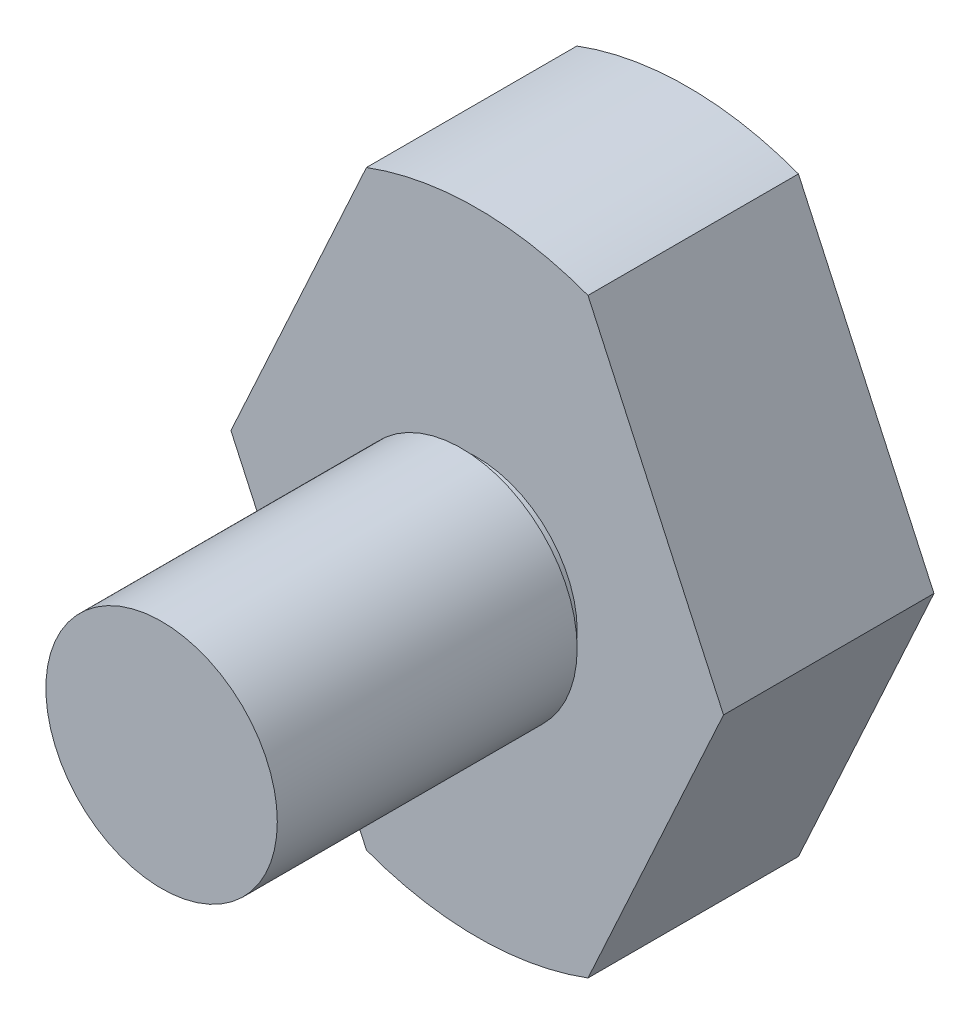
ISO-10303-21;
HEADER;
FILE_DESCRIPTION(('STEP AP214'),'2;1');
FILE_NAME('part.step','',(''),(''),'','','');
FILE_SCHEMA(('AUTOMOTIVE_DESIGN { 1 0 10303 214 1 1 1 1 }'));
ENDSEC;
DATA;
#1=APPLICATION_CONTEXT('core data for automotive mechanical design processes');
#2=APPLICATION_PROTOCOL_DEFINITION('international standard','automotive_design',2000,#1);
#3=PRODUCT_CONTEXT('',#1,'mechanical');
#4=PRODUCT('Part','Part','',(#3));
#5=PRODUCT_RELATED_PRODUCT_CATEGORY('part','',(#4));
#6=PRODUCT_DEFINITION_FORMATION('','',#4);
#7=PRODUCT_DEFINITION_CONTEXT('part definition',#1,'design');
#8=PRODUCT_DEFINITION('design','',#6,#7);
#9=PRODUCT_DEFINITION_SHAPE('','',#8);
#10=(LENGTH_UNIT() NAMED_UNIT(*) SI_UNIT(.MILLI.,.METRE.));
#11=(NAMED_UNIT(*) PLANE_ANGLE_UNIT() SI_UNIT($,.RADIAN.));
#12=(NAMED_UNIT(*) SI_UNIT($,.STERADIAN.) SOLID_ANGLE_UNIT());
#13=UNCERTAINTY_MEASURE_WITH_UNIT(LENGTH_MEASURE(1.E-05),#10,'distance_accuracy_value','');
#14=(GEOMETRIC_REPRESENTATION_CONTEXT(3) GLOBAL_UNCERTAINTY_ASSIGNED_CONTEXT((#13)) GLOBAL_UNIT_ASSIGNED_CONTEXT((#10,
#11,#12)) REPRESENTATION_CONTEXT('',''));
#15=CARTESIAN_POINT('',(0.,0.,0.));
#16=DIRECTION('',(0.,0.,1.));
#17=DIRECTION('',(1.,0.,0.));
#18=AXIS2_PLACEMENT_3D('',#15,#16,#17);
#19=CARTESIAN_POINT('',(30.,0.,-50.));
#20=DIRECTION('',(0.,0.,-1.));
#21=DIRECTION('',(-1.,0.,0.));
#22=AXIS2_PLACEMENT_3D('',#19,#20,#21);
#23=PLANE('',#22);
#24=DIRECTION('',(-0.416823601595534,0.908987395486278,0.));
#25=VECTOR('',#24,1.);
#26=CARTESIAN_POINT('',(-10.5276308280228,-28.0921517358294,-50.));
#27=LINE('',#26,#25);
#28=CARTESIAN_POINT('',(-10.5276308280228,-28.0921517358294,-50.));
#29=VERTEX_POINT('',#28);
#30=CARTESIAN_POINT('',(-23.4095166729112,0.,-50.));
#31=VERTEX_POINT('',#30);
#32=EDGE_CURVE('E101',#29,#31,#27,.T.);
#33=ORIENTED_EDGE('',*,*,#32,.T.);
#34=DIRECTION('',(0.416823601595534,0.908987395486278,0.));
#35=VECTOR('',#34,1.);
#36=CARTESIAN_POINT('',(-10.5276308280228,28.0921517358294,-50.));
#37=LINE('',#36,#35);
#38=CARTESIAN_POINT('',(-10.5276308280228,28.0921517358294,-50.));
#39=VERTEX_POINT('',#38);
#40=EDGE_CURVE('E111',#31,#39,#37,.T.);
#41=ORIENTED_EDGE('',*,*,#40,.T.);
#42=CARTESIAN_POINT('',(0.,0.,-50.));
#43=DIRECTION('',(0.,0.,1.));
#44=DIRECTION('',(1.,0.,0.));
#45=AXIS2_PLACEMENT_3D('',#42,#43,#44);
#46=CIRCLE('',#45,30.);
#47=CARTESIAN_POINT('',(10.5276308280228,28.0921517358294,-50.));
#48=VERTEX_POINT('',#47);
#49=EDGE_CURVE('E107',#48,#39,#46,.T.);
#50=ORIENTED_EDGE('',*,*,#49,.F.);
#51=DIRECTION('',(0.416823601595534,-0.908987395486278,0.));
#52=VECTOR('',#51,1.);
#53=CARTESIAN_POINT('',(10.5276308280228,28.0921517358294,-50.));
#54=LINE('',#53,#52);
#55=CARTESIAN_POINT('',(23.4095166729112,0.,-50.));
#56=VERTEX_POINT('',#55);
#57=EDGE_CURVE('E88',#48,#56,#54,.T.);
#58=ORIENTED_EDGE('',*,*,#57,.T.);
#59=DIRECTION('',(-0.416823601595534,-0.908987395486278,0.));
#60=VECTOR('',#59,1.);
#61=CARTESIAN_POINT('',(10.5276308280228,-28.0921517358294,-50.));
#62=LINE('',#61,#60);
#63=CARTESIAN_POINT('',(10.5276308280228,-28.0921517358294,-50.));
#64=VERTEX_POINT('',#63);
#65=EDGE_CURVE('E95',#56,#64,#62,.T.);
#66=ORIENTED_EDGE('',*,*,#65,.T.);
#67=EDGE_CURVE('E136',#29,#64,#46,.T.);
#68=ORIENTED_EDGE('',*,*,#67,.F.);
#69=EDGE_LOOP('',(#33,#41,#50,#58,#66,#68));
#70=FACE_BOUND('',#69,.T.);
#71=ADVANCED_FACE('F33',(#70),#23,.T.);
#72=CARTESIAN_POINT('',(0.,0.,0.));
#73=DIRECTION('',(0.,0.,1.));
#74=DIRECTION('',(1.,0.,0.));
#75=AXIS2_PLACEMENT_3D('',#72,#73,#74);
#76=CYLINDRICAL_SURFACE('',#75,30.);
#77=ORIENTED_EDGE('',*,*,#49,.T.);
#78=DIRECTION('',(0.,0.,-1.));
#79=VECTOR('',#78,1.);
#80=CARTESIAN_POINT('',(-10.5276308280228,28.0921517358294,-20.));
#81=LINE('',#80,#79);
#82=CARTESIAN_POINT('',(-10.5276308280228,28.0921517358294,-30.));
#83=VERTEX_POINT('',#82);
#84=EDGE_CURVE('E113',#83,#39,#81,.T.);
#85=ORIENTED_EDGE('',*,*,#84,.F.);
#86=CARTESIAN_POINT('',(0.,0.,-30.));
#87=DIRECTION('',(0.,0.,1.));
#88=DIRECTION('',(1.,0.,0.));
#89=AXIS2_PLACEMENT_3D('',#86,#87,#88);
#90=CIRCLE('',#89,30.);
#91=CARTESIAN_POINT('',(10.5276308280228,28.0921517358294,-30.));
#92=VERTEX_POINT('',#91);
#93=EDGE_CURVE('E133',#92,#83,#90,.T.);
#94=ORIENTED_EDGE('',*,*,#93,.F.);
#95=DIRECTION('',(0.,0.,-1.));
#96=VECTOR('',#95,1.);
#97=CARTESIAN_POINT('',(10.5276308280228,28.0921517358294,-20.));
#98=LINE('',#97,#96);
#99=EDGE_CURVE('E56',#92,#48,#98,.T.);
#100=ORIENTED_EDGE('',*,*,#99,.T.);
#101=EDGE_LOOP('',(#77,#85,#94,#100));
#102=FACE_BOUND('',#101,.T.);
#103=ADVANCED_FACE('F154',(#102),#76,.T.);
#104=CARTESIAN_POINT('',(-10.5276308280228,-28.0921517358294,-30.));
#105=VERTEX_POINT('',#104);
#106=CARTESIAN_POINT('',(10.5276308280228,-28.0921517358294,-30.));
#107=VERTEX_POINT('',#106);
#108=EDGE_CURVE('E132',#105,#107,#90,.T.);
#109=ORIENTED_EDGE('',*,*,#108,.F.);
#110=DIRECTION('',(0.,0.,-1.));
#111=VECTOR('',#110,1.);
#112=CARTESIAN_POINT('',(-10.5276308280228,-28.0921517358294,-20.));
#113=LINE('',#112,#111);
#114=EDGE_CURVE('E48',#105,#29,#113,.T.);
#115=ORIENTED_EDGE('',*,*,#114,.T.);
#116=ORIENTED_EDGE('',*,*,#67,.T.);
#117=DIRECTION('',(0.,0.,-1.));
#118=VECTOR('',#117,1.);
#119=CARTESIAN_POINT('',(10.5276308280228,-28.0921517358294,-20.));
#120=LINE('',#119,#118);
#121=EDGE_CURVE('E92',#107,#64,#120,.T.);
#122=ORIENTED_EDGE('',*,*,#121,.F.);
#123=EDGE_LOOP('',(#109,#115,#116,#122));
#124=FACE_BOUND('',#123,.T.);
#125=ADVANCED_FACE('F146',(#124),#76,.T.);
#126=CARTESIAN_POINT('',(30.,0.,-30.));
#127=DIRECTION('',(0.,0.,1.));
#128=DIRECTION('',(1.,0.,0.));
#129=AXIS2_PLACEMENT_3D('',#126,#127,#128);
#130=PLANE('',#129);
#131=CARTESIAN_POINT('',(0.,0.,-30.));
#132=DIRECTION('',(0.,0.,1.));
#133=DIRECTION('',(1.,0.,0.));
#134=AXIS2_PLACEMENT_3D('',#131,#132,#133);
#135=CIRCLE('',#134,9.5);
#136=CARTESIAN_POINT('',(9.5,0.,-30.));
#137=VERTEX_POINT('',#136);
#138=EDGE_CURVE('E129',#137,#137,#135,.T.);
#139=ORIENTED_EDGE('',*,*,#138,.F.);
#140=EDGE_LOOP('',(#139));
#141=FACE_BOUND('',#140,.T.);
#142=ORIENTED_EDGE('',*,*,#93,.T.);
#143=DIRECTION('',(-0.416823601595534,-0.908987395486278,0.));
#144=VECTOR('',#143,1.);
#145=CARTESIAN_POINT('',(-14.130044975103,20.2361929070039,-30.));
#146=LINE('',#145,#144);
#147=CARTESIAN_POINT('',(-23.4095166729112,0.,-30.));
#148=VERTEX_POINT('',#147);
#149=EDGE_CURVE('E11',#83,#148,#146,.T.);
#150=ORIENTED_EDGE('',*,*,#149,.T.);
#151=DIRECTION('',(0.416823601595534,-0.908987395486278,0.));
#152=VECTOR('',#151,1.);
#153=CARTESIAN_POINT('',(-14.130044975103,-20.2361929070039,-30.));
#154=LINE('',#153,#152);
#155=EDGE_CURVE('E41',#148,#105,#154,.T.);
#156=ORIENTED_EDGE('',*,*,#155,.T.);
#157=ORIENTED_EDGE('',*,*,#108,.T.);
#158=DIRECTION('',(0.416823601595534,0.908987395486278,0.));
#159=VECTOR('',#158,1.);
#160=CARTESIAN_POINT('',(24.5545598659273,2.49705109248823,-30.));
#161=LINE('',#160,#159);
#162=CARTESIAN_POINT('',(23.4095166729112,0.,-30.));
#163=VERTEX_POINT('',#162);
#164=EDGE_CURVE('E139',#107,#163,#161,.T.);
#165=ORIENTED_EDGE('',*,*,#164,.T.);
#166=DIRECTION('',(-0.416823601595534,0.908987395486278,0.));
#167=VECTOR('',#166,1.);
#168=CARTESIAN_POINT('',(24.5545598659273,-2.49705109248823,-30.));
#169=LINE('',#168,#167);
#170=EDGE_CURVE('E89',#163,#92,#169,.T.);
#171=ORIENTED_EDGE('',*,*,#170,.T.);
#172=EDGE_LOOP('',(#142,#150,#156,#157,#165,#171));
#173=FACE_BOUND('',#172,.T.);
#174=ADVANCED_FACE('F143',(#141,#173),#130,.T.);
#175=CARTESIAN_POINT('',(11.,0.,0.));
#176=DIRECTION('',(0.,0.,1.));
#177=DIRECTION('',(1.,0.,0.));
#178=AXIS2_PLACEMENT_3D('',#175,#176,#177);
#179=PLANE('',#178);
#180=CARTESIAN_POINT('',(0.,0.,0.));
#181=DIRECTION('',(0.,0.,1.));
#182=DIRECTION('',(1.,0.,0.));
#183=AXIS2_PLACEMENT_3D('',#180,#181,#182);
#184=CIRCLE('',#183,11.);
#185=CARTESIAN_POINT('',(11.,0.,0.));
#186=VERTEX_POINT('',#185);
#187=EDGE_CURVE('E115',#186,#186,#184,.T.);
#188=ORIENTED_EDGE('',*,*,#187,.T.);
#189=EDGE_LOOP('',(#188));
#190=FACE_BOUND('',#189,.T.);
#191=ADVANCED_FACE('F35',(#190),#179,.T.);
#192=CARTESIAN_POINT('',(0.,0.,0.));
#193=DIRECTION('',(0.,0.,1.));
#194=DIRECTION('',(1.,0.,0.));
#195=AXIS2_PLACEMENT_3D('',#192,#193,#194);
#196=CYLINDRICAL_SURFACE('',#195,9.5);
#197=ORIENTED_EDGE('',*,*,#138,.T.);
#198=EDGE_LOOP('',(#197));
#199=FACE_BOUND('',#198,.T.);
#200=CARTESIAN_POINT('',(0.,0.,-28.5));
#201=DIRECTION('',(0.,0.,1.));
#202=DIRECTION('',(1.,0.,0.));
#203=AXIS2_PLACEMENT_3D('',#200,#201,#202);
#204=CIRCLE('',#203,9.5);
#205=CARTESIAN_POINT('',(9.5,0.,-28.5));
#206=VERTEX_POINT('',#205);
#207=EDGE_CURVE('E126',#206,#206,#204,.T.);
#208=ORIENTED_EDGE('',*,*,#207,.F.);
#209=EDGE_LOOP('',(#208));
#210=FACE_BOUND('',#209,.T.);
#211=ADVANCED_FACE('F165',(#199,#210),#196,.T.);
#212=CARTESIAN_POINT('',(9.5,0.,-28.5));
#213=DIRECTION('',(0.,0.,-1.));
#214=DIRECTION('',(-1.,0.,0.));
#215=AXIS2_PLACEMENT_3D('',#212,#213,#214);
#216=PLANE('',#215);
#217=ORIENTED_EDGE('',*,*,#207,.T.);
#218=EDGE_LOOP('',(#217));
#219=FACE_BOUND('',#218,.T.);
#220=CARTESIAN_POINT('',(0.,0.,-28.5));
#221=DIRECTION('',(0.,0.,1.));
#222=DIRECTION('',(1.,0.,0.));
#223=AXIS2_PLACEMENT_3D('',#220,#221,#222);
#224=CIRCLE('',#223,11.);
#225=CARTESIAN_POINT('',(11.,0.,-28.5));
#226=VERTEX_POINT('',#225);
#227=EDGE_CURVE('E123',#226,#226,#224,.T.);
#228=ORIENTED_EDGE('',*,*,#227,.F.);
#229=EDGE_LOOP('',(#228));
#230=FACE_BOUND('',#229,.T.);
#231=ADVANCED_FACE('F168',(#219,#230),#216,.T.);
#232=CARTESIAN_POINT('',(0.,0.,0.));
#233=DIRECTION('',(0.,0.,1.));
#234=DIRECTION('',(1.,0.,0.));
#235=AXIS2_PLACEMENT_3D('',#232,#233,#234);
#236=CYLINDRICAL_SURFACE('',#235,11.);
#237=ORIENTED_EDGE('',*,*,#227,.T.);
#238=EDGE_LOOP('',(#237));
#239=FACE_BOUND('',#238,.T.);
#240=ORIENTED_EDGE('',*,*,#187,.F.);
#241=EDGE_LOOP('',(#240));
#242=FACE_BOUND('',#241,.T.);
#243=ADVANCED_FACE('F172',(#239,#242),#236,.T.);
#244=CARTESIAN_POINT('',(10.5276308280228,28.0921517358294,-20.));
#245=DIRECTION('',(0.908987395486278,0.416823601595534,0.));
#246=DIRECTION('',(-0.416823601595534,0.908987395486278,0.));
#247=AXIS2_PLACEMENT_3D('',#244,#245,#246);
#248=PLANE('',#247);
#249=DIRECTION('',(0.,0.,-1.));
#250=VECTOR('',#249,1.);
#251=CARTESIAN_POINT('',(23.4095166729112,0.,-20.));
#252=LINE('',#251,#250);
#253=EDGE_CURVE('E84',#163,#56,#252,.T.);
#254=ORIENTED_EDGE('',*,*,#253,.T.);
#255=ORIENTED_EDGE('',*,*,#57,.F.);
#256=ORIENTED_EDGE('',*,*,#99,.F.);
#257=ORIENTED_EDGE('',*,*,#170,.F.);
#258=EDGE_LOOP('',(#254,#255,#256,#257));
#259=FACE_BOUND('',#258,.T.);
#260=ADVANCED_FACE('F86',(#259),#248,.T.);
#261=CARTESIAN_POINT('',(10.5276308280228,-28.0921517358294,-20.));
#262=DIRECTION('',(0.908987395486278,-0.416823601595534,0.));
#263=DIRECTION('',(0.416823601595534,0.908987395486278,0.));
#264=AXIS2_PLACEMENT_3D('',#261,#262,#263);
#265=PLANE('',#264);
#266=ORIENTED_EDGE('',*,*,#121,.T.);
#267=ORIENTED_EDGE('',*,*,#65,.F.);
#268=ORIENTED_EDGE('',*,*,#253,.F.);
#269=ORIENTED_EDGE('',*,*,#164,.F.);
#270=EDGE_LOOP('',(#266,#267,#268,#269));
#271=FACE_BOUND('',#270,.T.);
#272=ADVANCED_FACE('F96',(#271),#265,.T.);
#273=CARTESIAN_POINT('',(-10.5276308280228,28.0921517358294,-20.));
#274=DIRECTION('',(-0.908987395486278,0.416823601595534,0.));
#275=DIRECTION('',(-0.416823601595534,-0.908987395486278,0.));
#276=AXIS2_PLACEMENT_3D('',#273,#274,#275);
#277=PLANE('',#276);
#278=ORIENTED_EDGE('',*,*,#84,.T.);
#279=ORIENTED_EDGE('',*,*,#40,.F.);
#280=DIRECTION('',(0.,0.,-1.));
#281=VECTOR('',#280,1.);
#282=CARTESIAN_POINT('',(-23.4095166729112,0.,-20.));
#283=LINE('',#282,#281);
#284=EDGE_CURVE('E116',#148,#31,#283,.T.);
#285=ORIENTED_EDGE('',*,*,#284,.F.);
#286=ORIENTED_EDGE('',*,*,#149,.F.);
#287=EDGE_LOOP('',(#278,#279,#285,#286));
#288=FACE_BOUND('',#287,.T.);
#289=ADVANCED_FACE('F150',(#288),#277,.T.);
#290=CARTESIAN_POINT('',(-10.5276308280228,-28.0921517358294,-20.));
#291=DIRECTION('',(-0.908987395486278,-0.416823601595534,0.));
#292=DIRECTION('',(0.416823601595534,-0.908987395486278,0.));
#293=AXIS2_PLACEMENT_3D('',#290,#291,#292);
#294=PLANE('',#293);
#295=ORIENTED_EDGE('',*,*,#284,.T.);
#296=ORIENTED_EDGE('',*,*,#32,.F.);
#297=ORIENTED_EDGE('',*,*,#114,.F.);
#298=ORIENTED_EDGE('',*,*,#155,.F.);
#299=EDGE_LOOP('',(#295,#296,#297,#298));
#300=FACE_BOUND('',#299,.T.);
#301=ADVANCED_FACE('F148',(#300),#294,.T.);
#302=CLOSED_SHELL('',(#71,#103,#125,#174,#191,#211,#231,#243,#260,#272,#289,#301));
#303=MANIFOLD_SOLID_BREP('B2',#302);
#304=ADVANCED_BREP_SHAPE_REPRESENTATION('',(#18,#303),#14);
#305=SHAPE_DEFINITION_REPRESENTATION(#9,#304);
ENDSEC;
END-ISO-10303-21;
